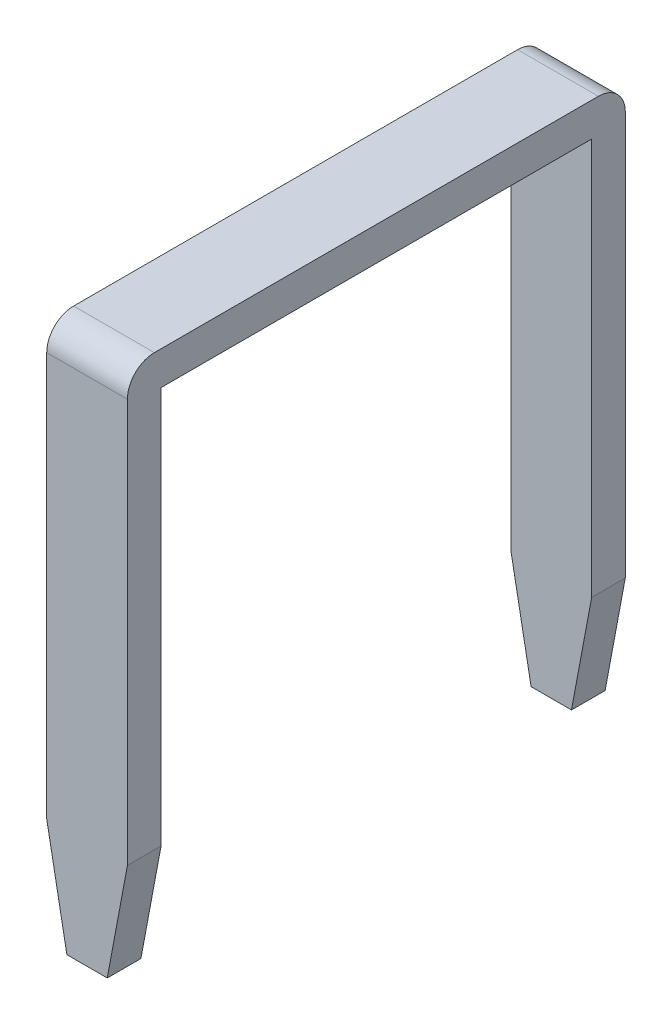
ISO-10303-21;
HEADER;
FILE_DESCRIPTION(('STEP AP214'),'2;1');
FILE_NAME('part.step','',(''),(''),'','','');
FILE_SCHEMA(('AUTOMOTIVE_DESIGN { 1 0 10303 214 1 1 1 1 }'));
ENDSEC;
DATA;
#1=APPLICATION_CONTEXT('core data for automotive mechanical design processes');
#2=APPLICATION_PROTOCOL_DEFINITION('international standard','automotive_design',2000,#1);
#3=PRODUCT_CONTEXT('',#1,'mechanical');
#4=PRODUCT('Part','Part','',(#3));
#5=PRODUCT_RELATED_PRODUCT_CATEGORY('part','',(#4));
#6=PRODUCT_DEFINITION_FORMATION('','',#4);
#7=PRODUCT_DEFINITION_CONTEXT('part definition',#1,'design');
#8=PRODUCT_DEFINITION('design','',#6,#7);
#9=PRODUCT_DEFINITION_SHAPE('','',#8);
#10=(LENGTH_UNIT() NAMED_UNIT(*) SI_UNIT(.MILLI.,.METRE.));
#11=(NAMED_UNIT(*) PLANE_ANGLE_UNIT() SI_UNIT($,.RADIAN.));
#12=(NAMED_UNIT(*) SI_UNIT($,.STERADIAN.) SOLID_ANGLE_UNIT());
#13=UNCERTAINTY_MEASURE_WITH_UNIT(LENGTH_MEASURE(1.E-05),#10,'distance_accuracy_value','');
#14=(GEOMETRIC_REPRESENTATION_CONTEXT(3) GLOBAL_UNCERTAINTY_ASSIGNED_CONTEXT((#13)) GLOBAL_UNIT_ASSIGNED_CONTEXT((#10,
#11,#12)) REPRESENTATION_CONTEXT('',''));
#15=CARTESIAN_POINT('',(0.,0.,0.));
#16=DIRECTION('',(0.,0.,1.));
#17=DIRECTION('',(1.,0.,0.));
#18=AXIS2_PLACEMENT_3D('',#15,#16,#17);
#19=CARTESIAN_POINT('',(0.15,-4.,-3.355));
#20=DIRECTION('',(-0.982872186934322,0.184288535050186,0.));
#21=DIRECTION('',(-0.184288535050186,-0.982872186934322,0.));
#22=AXIS2_PLACEMENT_3D('',#19,#20,#21);
#23=PLANE('',#22);
#24=DIRECTION('',(-0.184288535050186,-0.982872186934322,0.));
#25=VECTOR('',#24,1.);
#26=CARTESIAN_POINT('',(0.3,-3.2,-1.85));
#27=LINE('',#26,#25);
#28=CARTESIAN_POINT('',(0.3,-3.2,-1.85));
#29=VERTEX_POINT('',#28);
#30=CARTESIAN_POINT('',(0.15,-4.,-1.85));
#31=VERTEX_POINT('',#30);
#32=EDGE_CURVE('E182',#29,#31,#27,.T.);
#33=ORIENTED_EDGE('',*,*,#32,.F.);
#34=DIRECTION('',(0.,0.,1.));
#35=VECTOR('',#34,1.);
#36=CARTESIAN_POINT('',(0.3,-3.2,-1.65));
#37=LINE('',#36,#35);
#38=CARTESIAN_POINT('',(0.3,-3.2,-1.6));
#39=VERTEX_POINT('',#38);
#40=EDGE_CURVE('E207',#29,#39,#37,.T.);
#41=ORIENTED_EDGE('',*,*,#40,.T.);
#42=DIRECTION('',(-0.184288535050186,-0.982872186934322,0.));
#43=VECTOR('',#42,1.);
#44=CARTESIAN_POINT('',(0.300000000000001,-3.2,-1.6));
#45=LINE('',#44,#43);
#46=CARTESIAN_POINT('',(0.15,-4.,-1.6));
#47=VERTEX_POINT('',#46);
#48=EDGE_CURVE('E195',#39,#47,#45,.T.);
#49=ORIENTED_EDGE('',*,*,#48,.T.);
#50=DIRECTION('',(0.,0.,-1.));
#51=VECTOR('',#50,1.);
#52=CARTESIAN_POINT('',(0.15,-4.,-1.85));
#53=LINE('',#52,#51);
#54=EDGE_CURVE('E216',#31,#47,#53,.F.);
#55=ORIENTED_EDGE('',*,*,#54,.F.);
#56=EDGE_LOOP('',(#33,#41,#49,#55));
#57=FACE_BOUND('',#56,.T.);
#58=ADVANCED_FACE('F17',(#57),#23,.F.);
#59=CARTESIAN_POINT('',(0.3,-4.,-1.85));
#60=DIRECTION('',(0.,-1.,0.));
#61=DIRECTION('',(0.,0.,-1.));
#62=AXIS2_PLACEMENT_3D('',#59,#60,#61);
#63=PLANE('',#62);
#64=DIRECTION('',(0.,0.,1.));
#65=VECTOR('',#64,1.);
#66=CARTESIAN_POINT('',(-0.15,-4.,-3.355));
#67=LINE('',#66,#65);
#68=CARTESIAN_POINT('',(-0.15,-4.,-1.6));
#69=VERTEX_POINT('',#68);
#70=CARTESIAN_POINT('',(-0.15,-4.,-1.85));
#71=VERTEX_POINT('',#70);
#72=EDGE_CURVE('E185',#69,#71,#67,.F.);
#73=ORIENTED_EDGE('',*,*,#72,.T.);
#74=DIRECTION('',(1.,0.,0.));
#75=VECTOR('',#74,1.);
#76=CARTESIAN_POINT('',(0.3,-4.,-1.85));
#77=LINE('',#76,#75);
#78=EDGE_CURVE('E178',#31,#71,#77,.F.);
#79=ORIENTED_EDGE('',*,*,#78,.F.);
#80=ORIENTED_EDGE('',*,*,#54,.T.);
#81=DIRECTION('',(1.,0.,0.));
#82=VECTOR('',#81,1.);
#83=CARTESIAN_POINT('',(0.3,-4.,-1.6));
#84=LINE('',#83,#82);
#85=EDGE_CURVE('E191',#47,#69,#84,.F.);
#86=ORIENTED_EDGE('',*,*,#85,.T.);
#87=EDGE_LOOP('',(#73,#79,#80,#86));
#88=FACE_BOUND('',#87,.T.);
#89=ADVANCED_FACE('F331',(#88),#63,.T.);
#90=CARTESIAN_POINT('',(0.3,-4.,1.6));
#91=DIRECTION('',(0.,-1.,0.));
#92=DIRECTION('',(0.,0.,-1.));
#93=AXIS2_PLACEMENT_3D('',#90,#91,#92);
#94=PLANE('',#93);
#95=DIRECTION('',(0.,0.,1.));
#96=VECTOR('',#95,1.);
#97=CARTESIAN_POINT('',(-0.15,-4.,-3.355));
#98=LINE('',#97,#96);
#99=CARTESIAN_POINT('',(-0.149999999999999,-4.,1.85));
#100=VERTEX_POINT('',#99);
#101=CARTESIAN_POINT('',(-0.15,-4.,1.6));
#102=VERTEX_POINT('',#101);
#103=EDGE_CURVE('E168',#100,#102,#98,.F.);
#104=ORIENTED_EDGE('',*,*,#103,.T.);
#105=DIRECTION('',(1.,0.,0.));
#106=VECTOR('',#105,1.);
#107=CARTESIAN_POINT('',(0.3,-4.,1.6));
#108=LINE('',#107,#106);
#109=CARTESIAN_POINT('',(0.15,-4.,1.6));
#110=VERTEX_POINT('',#109);
#111=EDGE_CURVE('E163',#102,#110,#108,.T.);
#112=ORIENTED_EDGE('',*,*,#111,.T.);
#113=DIRECTION('',(0.,0.,1.));
#114=VECTOR('',#113,1.);
#115=CARTESIAN_POINT('',(0.15,-4.,-3.355));
#116=LINE('',#115,#114);
#117=CARTESIAN_POINT('',(0.15,-4.,1.85));
#118=VERTEX_POINT('',#117);
#119=EDGE_CURVE('E209',#110,#118,#116,.T.);
#120=ORIENTED_EDGE('',*,*,#119,.T.);
#121=DIRECTION('',(1.,0.,0.));
#122=VECTOR('',#121,1.);
#123=CARTESIAN_POINT('',(0.3,-4.,1.85));
#124=LINE('',#123,#122);
#125=EDGE_CURVE('E147',#100,#118,#124,.T.);
#126=ORIENTED_EDGE('',*,*,#125,.F.);
#127=EDGE_LOOP('',(#104,#112,#120,#126));
#128=FACE_BOUND('',#127,.T.);
#129=ADVANCED_FACE('F319',(#128),#94,.T.);
#130=CARTESIAN_POINT('',(0.15,-4.,-3.355));
#131=DIRECTION('',(-0.982872186934322,0.184288535050186,0.));
#132=DIRECTION('',(-0.184288535050186,-0.982872186934322,0.));
#133=AXIS2_PLACEMENT_3D('',#130,#131,#132);
#134=PLANE('',#133);
#135=ORIENTED_EDGE('',*,*,#119,.F.);
#136=DIRECTION('',(0.184288535050186,0.982872186934322,0.));
#137=VECTOR('',#136,1.);
#138=CARTESIAN_POINT('',(0.15,-4.,1.6));
#139=LINE('',#138,#137);
#140=CARTESIAN_POINT('',(0.3,-3.2,1.6));
#141=VERTEX_POINT('',#140);
#142=EDGE_CURVE('E175',#110,#141,#139,.T.);
#143=ORIENTED_EDGE('',*,*,#142,.T.);
#144=DIRECTION('',(0.,0.,1.));
#145=VECTOR('',#144,1.);
#146=CARTESIAN_POINT('',(0.3,-3.2,-1.65));
#147=LINE('',#146,#145);
#148=CARTESIAN_POINT('',(0.300000000000001,-3.2,1.85));
#149=VERTEX_POINT('',#148);
#150=EDGE_CURVE('E171',#141,#149,#147,.T.);
#151=ORIENTED_EDGE('',*,*,#150,.T.);
#152=DIRECTION('',(0.184288535050186,0.982872186934322,0.));
#153=VECTOR('',#152,1.);
#154=CARTESIAN_POINT('',(0.15,-4.,1.85));
#155=LINE('',#154,#153);
#156=EDGE_CURVE('E170',#118,#149,#155,.T.);
#157=ORIENTED_EDGE('',*,*,#156,.F.);
#158=EDGE_LOOP('',(#135,#143,#151,#157));
#159=FACE_BOUND('',#158,.T.);
#160=ADVANCED_FACE('F322',(#159),#134,.F.);
#161=CARTESIAN_POINT('',(0.3,-0.2,-1.65));
#162=DIRECTION('',(-1.,0.,0.));
#163=DIRECTION('',(0.,0.,1.));
#164=AXIS2_PLACEMENT_3D('',#161,#162,#163);
#165=PLANE('',#164);
#166=ORIENTED_EDGE('',*,*,#150,.F.);
#167=DIRECTION('',(0.,-1.,0.));
#168=VECTOR('',#167,1.);
#169=CARTESIAN_POINT('',(0.3,-0.2,1.6));
#170=LINE('',#169,#168);
#171=CARTESIAN_POINT('',(0.3,-0.25,1.6));
#172=VERTEX_POINT('',#171);
#173=EDGE_CURVE('E157',#141,#172,#170,.F.);
#174=ORIENTED_EDGE('',*,*,#173,.T.);
#175=DIRECTION('',(0.,0.,1.));
#176=VECTOR('',#175,1.);
#177=CARTESIAN_POINT('',(0.3,-0.25,-1.65));
#178=LINE('',#177,#176);
#179=CARTESIAN_POINT('',(0.3,-0.25,-1.6));
#180=VERTEX_POINT('',#179);
#181=EDGE_CURVE('E194',#172,#180,#178,.F.);
#182=ORIENTED_EDGE('',*,*,#181,.T.);
#183=DIRECTION('',(0.,1.,0.));
#184=VECTOR('',#183,1.);
#185=CARTESIAN_POINT('',(0.3,-0.2,-1.6));
#186=LINE('',#185,#184);
#187=EDGE_CURVE('E200',#180,#39,#186,.F.);
#188=ORIENTED_EDGE('',*,*,#187,.T.);
#189=ORIENTED_EDGE('',*,*,#40,.F.);
#190=DIRECTION('',(0.,1.,0.));
#191=VECTOR('',#190,1.);
#192=CARTESIAN_POINT('',(0.3,-0.2,-1.85));
#193=LINE('',#192,#191);
#194=CARTESIAN_POINT('',(0.3,-0.2,-1.85));
#195=VERTEX_POINT('',#194);
#196=EDGE_CURVE('E188',#195,#29,#193,.F.);
#197=ORIENTED_EDGE('',*,*,#196,.F.);
#198=CARTESIAN_POINT('',(0.3,-0.2,-1.65));
#199=DIRECTION('',(-1.,0.,0.));
#200=DIRECTION('',(0.,0.,1.));
#201=AXIS2_PLACEMENT_3D('',#198,#199,#200);
#202=CIRCLE('',#201,0.2);
#203=CARTESIAN_POINT('',(0.3,0.,-1.65));
#204=VERTEX_POINT('',#203);
#205=EDGE_CURVE('E133',#204,#195,#202,.T.);
#206=ORIENTED_EDGE('',*,*,#205,.F.);
#207=DIRECTION('',(0.,0.,1.));
#208=VECTOR('',#207,1.);
#209=CARTESIAN_POINT('',(0.3,0.,-1.65));
#210=LINE('',#209,#208);
#211=CARTESIAN_POINT('',(0.3,0.,1.65));
#212=VERTEX_POINT('',#211);
#213=EDGE_CURVE('E129',#212,#204,#210,.F.);
#214=ORIENTED_EDGE('',*,*,#213,.F.);
#215=CARTESIAN_POINT('',(0.3,-0.2,1.65));
#216=DIRECTION('',(-1.,0.,0.));
#217=DIRECTION('',(0.,0.,1.));
#218=AXIS2_PLACEMENT_3D('',#215,#216,#217);
#219=CIRCLE('',#218,0.2);
#220=CARTESIAN_POINT('',(0.3,-0.2,1.85));
#221=VERTEX_POINT('',#220);
#222=EDGE_CURVE('E20',#221,#212,#219,.T.);
#223=ORIENTED_EDGE('',*,*,#222,.F.);
#224=DIRECTION('',(0.,-1.,0.));
#225=VECTOR('',#224,1.);
#226=CARTESIAN_POINT('',(0.300000000000001,-0.2,1.85));
#227=LINE('',#226,#225);
#228=EDGE_CURVE('E115',#149,#221,#227,.F.);
#229=ORIENTED_EDGE('',*,*,#228,.F.);
#230=EDGE_LOOP('',(#166,#174,#182,#188,#189,#197,#206,#214,#223,#229));
#231=FACE_BOUND('',#230,.T.);
#232=ADVANCED_FACE('F131',(#231),#165,.F.);
#233=CARTESIAN_POINT('',(-0.15,-4.,-3.355));
#234=DIRECTION('',(0.982872186934322,0.184288535050186,0.));
#235=DIRECTION('',(-0.184288535050186,0.982872186934322,0.));
#236=AXIS2_PLACEMENT_3D('',#233,#234,#235);
#237=PLANE('',#236);
#238=DIRECTION('',(0.,0.,1.));
#239=VECTOR('',#238,1.);
#240=CARTESIAN_POINT('',(-0.3,-3.2,-1.65));
#241=LINE('',#240,#239);
#242=CARTESIAN_POINT('',(-0.3,-3.2,1.6));
#243=VERTEX_POINT('',#242);
#244=CARTESIAN_POINT('',(-0.3,-3.2,1.85));
#245=VERTEX_POINT('',#244);
#246=EDGE_CURVE('E153',#243,#245,#241,.T.);
#247=ORIENTED_EDGE('',*,*,#246,.F.);
#248=DIRECTION('',(0.184288535050186,-0.982872186934322,0.));
#249=VECTOR('',#248,1.);
#250=CARTESIAN_POINT('',(-0.3,-3.2,1.6));
#251=LINE('',#250,#249);
#252=EDGE_CURVE('E160',#243,#102,#251,.T.);
#253=ORIENTED_EDGE('',*,*,#252,.T.);
#254=ORIENTED_EDGE('',*,*,#103,.F.);
#255=DIRECTION('',(0.184288535050186,-0.982872186934322,0.));
#256=VECTOR('',#255,1.);
#257=CARTESIAN_POINT('',(-0.3,-3.2,1.85));
#258=LINE('',#257,#256);
#259=EDGE_CURVE('E148',#245,#100,#258,.T.);
#260=ORIENTED_EDGE('',*,*,#259,.F.);
#261=EDGE_LOOP('',(#247,#253,#254,#260));
#262=FACE_BOUND('',#261,.T.);
#263=ADVANCED_FACE('F313',(#262),#237,.F.);
#264=CARTESIAN_POINT('',(0.3,-0.2,1.85));
#265=DIRECTION('',(0.,0.,1.));
#266=DIRECTION('',(0.,-1.,0.));
#267=AXIS2_PLACEMENT_3D('',#264,#265,#266);
#268=PLANE('',#267);
#269=ORIENTED_EDGE('',*,*,#259,.T.);
#270=ORIENTED_EDGE('',*,*,#125,.T.);
#271=ORIENTED_EDGE('',*,*,#156,.T.);
#272=ORIENTED_EDGE('',*,*,#228,.T.);
#273=DIRECTION('',(-1.,0.,0.));
#274=VECTOR('',#273,1.);
#275=CARTESIAN_POINT('',(0.3,-0.2,1.85));
#276=LINE('',#275,#274);
#277=CARTESIAN_POINT('',(-0.3,-0.2,1.85));
#278=VERTEX_POINT('',#277);
#279=EDGE_CURVE('E126',#278,#221,#276,.F.);
#280=ORIENTED_EDGE('',*,*,#279,.F.);
#281=DIRECTION('',(0.,1.,0.));
#282=VECTOR('',#281,1.);
#283=CARTESIAN_POINT('',(-0.3,-0.2,1.85));
#284=LINE('',#283,#282);
#285=EDGE_CURVE('E156',#245,#278,#284,.T.);
#286=ORIENTED_EDGE('',*,*,#285,.F.);
#287=EDGE_LOOP('',(#269,#270,#271,#272,#280,#286));
#288=FACE_BOUND('',#287,.T.);
#289=ADVANCED_FACE('F316',(#288),#268,.T.);
#290=CARTESIAN_POINT('',(0.3,-0.2,1.65));
#291=DIRECTION('',(-1.,0.,0.));
#292=DIRECTION('',(0.,0.,1.));
#293=AXIS2_PLACEMENT_3D('',#290,#291,#292);
#294=CYLINDRICAL_SURFACE('',#293,0.2);
#295=ORIENTED_EDGE('',*,*,#222,.T.);
#296=DIRECTION('',(1.,0.,0.));
#297=VECTOR('',#296,1.);
#298=CARTESIAN_POINT('',(0.3,0.,1.65));
#299=LINE('',#298,#297);
#300=CARTESIAN_POINT('',(-0.3,0.,1.65));
#301=VERTEX_POINT('',#300);
#302=EDGE_CURVE('E124',#301,#212,#299,.T.);
#303=ORIENTED_EDGE('',*,*,#302,.F.);
#304=CARTESIAN_POINT('',(-0.3,-0.2,1.65));
#305=DIRECTION('',(-1.,0.,0.));
#306=DIRECTION('',(0.,0.,1.));
#307=AXIS2_PLACEMENT_3D('',#304,#305,#306);
#308=CIRCLE('',#307,0.2);
#309=EDGE_CURVE('E255',#278,#301,#308,.T.);
#310=ORIENTED_EDGE('',*,*,#309,.F.);
#311=ORIENTED_EDGE('',*,*,#279,.T.);
#312=EDGE_LOOP('',(#295,#303,#310,#311));
#313=FACE_BOUND('',#312,.T.);
#314=ADVANCED_FACE('F121',(#313),#294,.T.);
#315=CARTESIAN_POINT('',(0.3,0.,-1.65));
#316=DIRECTION('',(0.,1.,0.));
#317=DIRECTION('',(0.,0.,1.));
#318=AXIS2_PLACEMENT_3D('',#315,#316,#317);
#319=PLANE('',#318);
#320=ORIENTED_EDGE('',*,*,#213,.T.);
#321=DIRECTION('',(-1.,0.,0.));
#322=VECTOR('',#321,1.);
#323=CARTESIAN_POINT('',(0.3,0.,-1.65));
#324=LINE('',#323,#322);
#325=CARTESIAN_POINT('',(-0.3,0.,-1.65));
#326=VERTEX_POINT('',#325);
#327=EDGE_CURVE('E136',#326,#204,#324,.F.);
#328=ORIENTED_EDGE('',*,*,#327,.F.);
#329=DIRECTION('',(0.,0.,1.));
#330=VECTOR('',#329,1.);
#331=CARTESIAN_POINT('',(-0.3,0.,-1.65));
#332=LINE('',#331,#330);
#333=EDGE_CURVE('E140',#301,#326,#332,.F.);
#334=ORIENTED_EDGE('',*,*,#333,.F.);
#335=ORIENTED_EDGE('',*,*,#302,.T.);
#336=EDGE_LOOP('',(#320,#328,#334,#335));
#337=FACE_BOUND('',#336,.T.);
#338=ADVANCED_FACE('F138',(#337),#319,.T.);
#339=CARTESIAN_POINT('',(0.3,-0.2,-1.65));
#340=DIRECTION('',(-1.,0.,0.));
#341=DIRECTION('',(0.,0.,1.));
#342=AXIS2_PLACEMENT_3D('',#339,#340,#341);
#343=CYLINDRICAL_SURFACE('',#342,0.2);
#344=ORIENTED_EDGE('',*,*,#205,.T.);
#345=DIRECTION('',(1.,0.,0.));
#346=VECTOR('',#345,1.);
#347=CARTESIAN_POINT('',(0.3,-0.2,-1.85));
#348=LINE('',#347,#346);
#349=CARTESIAN_POINT('',(-0.3,-0.2,-1.85));
#350=VERTEX_POINT('',#349);
#351=EDGE_CURVE('E181',#350,#195,#348,.T.);
#352=ORIENTED_EDGE('',*,*,#351,.F.);
#353=CARTESIAN_POINT('',(-0.3,-0.2,-1.65));
#354=DIRECTION('',(-1.,0.,0.));
#355=DIRECTION('',(0.,0.,1.));
#356=AXIS2_PLACEMENT_3D('',#353,#354,#355);
#357=CIRCLE('',#356,0.2);
#358=EDGE_CURVE('E251',#326,#350,#357,.T.);
#359=ORIENTED_EDGE('',*,*,#358,.F.);
#360=ORIENTED_EDGE('',*,*,#327,.T.);
#361=EDGE_LOOP('',(#344,#352,#359,#360));
#362=FACE_BOUND('',#361,.T.);
#363=ADVANCED_FACE('F258',(#362),#343,.T.);
#364=CARTESIAN_POINT('',(0.3,-0.2,-1.85));
#365=DIRECTION('',(0.,0.,-1.));
#366=DIRECTION('',(0.,1.,0.));
#367=AXIS2_PLACEMENT_3D('',#364,#365,#366);
#368=PLANE('',#367);
#369=ORIENTED_EDGE('',*,*,#351,.T.);
#370=ORIENTED_EDGE('',*,*,#196,.T.);
#371=ORIENTED_EDGE('',*,*,#32,.T.);
#372=ORIENTED_EDGE('',*,*,#78,.T.);
#373=DIRECTION('',(-0.184288535050186,0.982872186934322,0.));
#374=VECTOR('',#373,1.);
#375=CARTESIAN_POINT('',(-0.15,-4.,-1.85));
#376=LINE('',#375,#374);
#377=CARTESIAN_POINT('',(-0.3,-3.2,-1.85));
#378=VERTEX_POINT('',#377);
#379=EDGE_CURVE('E187',#71,#378,#376,.T.);
#380=ORIENTED_EDGE('',*,*,#379,.T.);
#381=DIRECTION('',(0.,1.,0.));
#382=VECTOR('',#381,1.);
#383=CARTESIAN_POINT('',(-0.3,-0.2,-1.85));
#384=LINE('',#383,#382);
#385=EDGE_CURVE('E254',#350,#378,#384,.F.);
#386=ORIENTED_EDGE('',*,*,#385,.F.);
#387=EDGE_LOOP('',(#369,#370,#371,#372,#380,#386));
#388=FACE_BOUND('',#387,.T.);
#389=ADVANCED_FACE('F289',(#388),#368,.T.);
#390=CARTESIAN_POINT('',(-0.15,-4.,-3.355));
#391=DIRECTION('',(0.982872186934322,0.184288535050186,0.));
#392=DIRECTION('',(-0.184288535050186,0.982872186934322,0.));
#393=AXIS2_PLACEMENT_3D('',#390,#391,#392);
#394=PLANE('',#393);
#395=ORIENTED_EDGE('',*,*,#379,.F.);
#396=ORIENTED_EDGE('',*,*,#72,.F.);
#397=DIRECTION('',(-0.184288535050186,0.982872186934322,0.));
#398=VECTOR('',#397,1.);
#399=CARTESIAN_POINT('',(-0.15,-4.,-1.6));
#400=LINE('',#399,#398);
#401=CARTESIAN_POINT('',(-0.3,-3.2,-1.6));
#402=VERTEX_POINT('',#401);
#403=EDGE_CURVE('E198',#69,#402,#400,.T.);
#404=ORIENTED_EDGE('',*,*,#403,.T.);
#405=DIRECTION('',(0.,0.,1.));
#406=VECTOR('',#405,1.);
#407=CARTESIAN_POINT('',(-0.3,-3.2,-1.65));
#408=LINE('',#407,#406);
#409=EDGE_CURVE('E279',#378,#402,#408,.T.);
#410=ORIENTED_EDGE('',*,*,#409,.F.);
#411=EDGE_LOOP('',(#395,#396,#404,#410));
#412=FACE_BOUND('',#411,.T.);
#413=ADVANCED_FACE('F292',(#412),#394,.F.);
#414=CARTESIAN_POINT('',(0.3,-0.2,-1.6));
#415=DIRECTION('',(0.,0.,-1.));
#416=DIRECTION('',(0.,1.,0.));
#417=AXIS2_PLACEMENT_3D('',#414,#415,#416);
#418=PLANE('',#417);
#419=ORIENTED_EDGE('',*,*,#48,.F.);
#420=ORIENTED_EDGE('',*,*,#187,.F.);
#421=DIRECTION('',(1.,0.,0.));
#422=VECTOR('',#421,1.);
#423=CARTESIAN_POINT('',(0.3,-0.25,-1.6));
#424=LINE('',#423,#422);
#425=CARTESIAN_POINT('',(-0.3,-0.25,-1.6));
#426=VERTEX_POINT('',#425);
#427=EDGE_CURVE('E275',#180,#426,#424,.F.);
#428=ORIENTED_EDGE('',*,*,#427,.T.);
#429=DIRECTION('',(0.,1.,0.));
#430=VECTOR('',#429,1.);
#431=CARTESIAN_POINT('',(-0.3,-0.2,-1.6));
#432=LINE('',#431,#430);
#433=EDGE_CURVE('E282',#402,#426,#432,.T.);
#434=ORIENTED_EDGE('',*,*,#433,.F.);
#435=ORIENTED_EDGE('',*,*,#403,.F.);
#436=ORIENTED_EDGE('',*,*,#85,.F.);
#437=EDGE_LOOP('',(#419,#420,#428,#434,#435,#436));
#438=FACE_BOUND('',#437,.T.);
#439=ADVANCED_FACE('F303',(#438),#418,.F.);
#440=CARTESIAN_POINT('',(0.3,-0.25,-1.65));
#441=DIRECTION('',(0.,1.,0.));
#442=DIRECTION('',(0.,0.,1.));
#443=AXIS2_PLACEMENT_3D('',#440,#441,#442);
#444=PLANE('',#443);
#445=ORIENTED_EDGE('',*,*,#427,.F.);
#446=ORIENTED_EDGE('',*,*,#181,.F.);
#447=DIRECTION('',(1.,0.,0.));
#448=VECTOR('',#447,1.);
#449=CARTESIAN_POINT('',(0.3,-0.25,1.6));
#450=LINE('',#449,#448);
#451=CARTESIAN_POINT('',(-0.3,-0.25,1.6));
#452=VERTEX_POINT('',#451);
#453=EDGE_CURVE('E35',#172,#452,#450,.F.);
#454=ORIENTED_EDGE('',*,*,#453,.T.);
#455=DIRECTION('',(0.,0.,1.));
#456=VECTOR('',#455,1.);
#457=CARTESIAN_POINT('',(-0.3,-0.25,-1.65));
#458=LINE('',#457,#456);
#459=EDGE_CURVE('E26',#426,#452,#458,.T.);
#460=ORIENTED_EDGE('',*,*,#459,.F.);
#461=EDGE_LOOP('',(#445,#446,#454,#460));
#462=FACE_BOUND('',#461,.T.);
#463=ADVANCED_FACE('F299',(#462),#444,.F.);
#464=CARTESIAN_POINT('',(0.3,-0.2,1.6));
#465=DIRECTION('',(0.,0.,1.));
#466=DIRECTION('',(0.,-1.,0.));
#467=AXIS2_PLACEMENT_3D('',#464,#465,#466);
#468=PLANE('',#467);
#469=ORIENTED_EDGE('',*,*,#142,.F.);
#470=ORIENTED_EDGE('',*,*,#111,.F.);
#471=ORIENTED_EDGE('',*,*,#252,.F.);
#472=DIRECTION('',(0.,1.,0.));
#473=VECTOR('',#472,1.);
#474=CARTESIAN_POINT('',(-0.3,-0.2,1.6));
#475=LINE('',#474,#473);
#476=EDGE_CURVE('E11',#452,#243,#475,.F.);
#477=ORIENTED_EDGE('',*,*,#476,.F.);
#478=ORIENTED_EDGE('',*,*,#453,.F.);
#479=ORIENTED_EDGE('',*,*,#173,.F.);
#480=EDGE_LOOP('',(#469,#470,#471,#477,#478,#479));
#481=FACE_BOUND('',#480,.T.);
#482=ADVANCED_FACE('F309',(#481),#468,.F.);
#483=CARTESIAN_POINT('',(-0.3,-0.2,-1.65));
#484=DIRECTION('',(-1.,0.,0.));
#485=DIRECTION('',(0.,0.,1.));
#486=AXIS2_PLACEMENT_3D('',#483,#484,#485);
#487=PLANE('',#486);
#488=ORIENTED_EDGE('',*,*,#459,.T.);
#489=ORIENTED_EDGE('',*,*,#476,.T.);
#490=ORIENTED_EDGE('',*,*,#246,.T.);
#491=ORIENTED_EDGE('',*,*,#285,.T.);
#492=ORIENTED_EDGE('',*,*,#309,.T.);
#493=ORIENTED_EDGE('',*,*,#333,.T.);
#494=ORIENTED_EDGE('',*,*,#358,.T.);
#495=ORIENTED_EDGE('',*,*,#385,.T.);
#496=ORIENTED_EDGE('',*,*,#409,.T.);
#497=ORIENTED_EDGE('',*,*,#433,.T.);
#498=EDGE_LOOP('',(#488,#489,#490,#491,#492,#493,#494,#495,#496,#497));
#499=FACE_BOUND('',#498,.T.);
#500=ADVANCED_FACE('F264',(#499),#487,.T.);
#501=CLOSED_SHELL('',(#58,#89,#129,#160,#232,#263,#289,#314,#338,#363,#389,#413,#439,#463,#482,#500));
#502=MANIFOLD_SOLID_BREP('B1',#501);
#503=ADVANCED_BREP_SHAPE_REPRESENTATION('',(#18,#502),#14);
#504=SHAPE_DEFINITION_REPRESENTATION(#9,#503);
ENDSEC;
END-ISO-10303-21;
